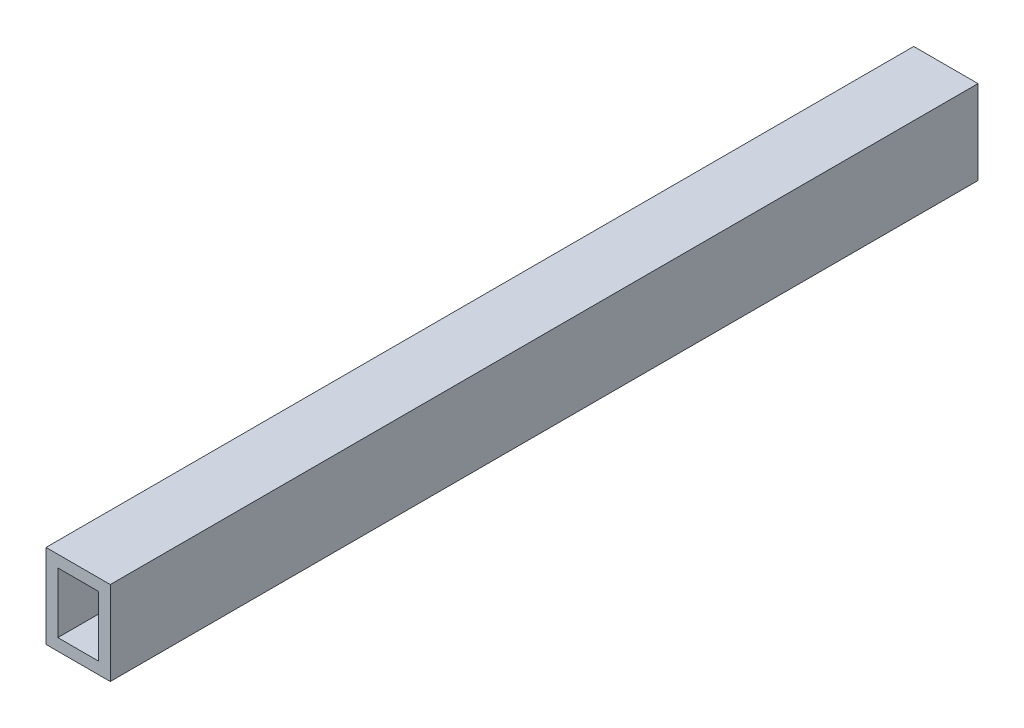
ISO-10303-21;
HEADER;
FILE_DESCRIPTION(('STEP AP214'),'2;1');
FILE_NAME('part.step','',(''),(''),'','','');
FILE_SCHEMA(('AUTOMOTIVE_DESIGN { 1 0 10303 214 1 1 1 1 }'));
ENDSEC;
DATA;
#1=APPLICATION_CONTEXT('core data for automotive mechanical design processes');
#2=APPLICATION_PROTOCOL_DEFINITION('international standard','automotive_design',2000,#1);
#3=PRODUCT_CONTEXT('',#1,'mechanical');
#4=PRODUCT('Part','Part','',(#3));
#5=PRODUCT_RELATED_PRODUCT_CATEGORY('part','',(#4));
#6=PRODUCT_DEFINITION_FORMATION('','',#4);
#7=PRODUCT_DEFINITION_CONTEXT('part definition',#1,'design');
#8=PRODUCT_DEFINITION('design','',#6,#7);
#9=PRODUCT_DEFINITION_SHAPE('','',#8);
#10=(LENGTH_UNIT() NAMED_UNIT(*) SI_UNIT(.MILLI.,.METRE.));
#11=(NAMED_UNIT(*) PLANE_ANGLE_UNIT() SI_UNIT($,.RADIAN.));
#12=(NAMED_UNIT(*) SI_UNIT($,.STERADIAN.) SOLID_ANGLE_UNIT());
#13=UNCERTAINTY_MEASURE_WITH_UNIT(LENGTH_MEASURE(1.E-05),#10,'distance_accuracy_value','');
#14=(GEOMETRIC_REPRESENTATION_CONTEXT(3) GLOBAL_UNCERTAINTY_ASSIGNED_CONTEXT((#13)) GLOBAL_UNIT_ASSIGNED_CONTEXT((#10,
#11,#12)) REPRESENTATION_CONTEXT('',''));
#15=CARTESIAN_POINT('',(0.,0.,0.));
#16=DIRECTION('',(0.,0.,1.));
#17=DIRECTION('',(1.,0.,0.));
#18=AXIS2_PLACEMENT_3D('',#15,#16,#17);
#19=CARTESIAN_POINT('',(0.,0.,220.));
#20=DIRECTION('',(0.,0.,1.));
#21=DIRECTION('',(1.,0.,0.));
#22=AXIS2_PLACEMENT_3D('',#19,#20,#21);
#23=PLANE('',#22);
#24=DIRECTION('',(0.,-1.,0.));
#25=VECTOR('',#24,1.);
#26=CARTESIAN_POINT('',(-8.15,10.65,220.));
#27=LINE('',#26,#25);
#28=CARTESIAN_POINT('',(-8.15,10.65,220.));
#29=VERTEX_POINT('',#28);
#30=CARTESIAN_POINT('',(-8.15,-10.65,220.));
#31=VERTEX_POINT('',#30);
#32=EDGE_CURVE('E136',#29,#31,#27,.T.);
#33=ORIENTED_EDGE('',*,*,#32,.T.);
#34=DIRECTION('',(1.,0.,0.));
#35=VECTOR('',#34,1.);
#36=CARTESIAN_POINT('',(-8.15,-10.65,220.));
#37=LINE('',#36,#35);
#38=CARTESIAN_POINT('',(8.15,-10.65,220.));
#39=VERTEX_POINT('',#38);
#40=EDGE_CURVE('E139',#31,#39,#37,.T.);
#41=ORIENTED_EDGE('',*,*,#40,.T.);
#42=DIRECTION('',(0.,1.,0.));
#43=VECTOR('',#42,1.);
#44=CARTESIAN_POINT('',(8.15,10.65,220.));
#45=LINE('',#44,#43);
#46=CARTESIAN_POINT('',(8.15,10.65,220.));
#47=VERTEX_POINT('',#46);
#48=EDGE_CURVE('E142',#39,#47,#45,.T.);
#49=ORIENTED_EDGE('',*,*,#48,.T.);
#50=DIRECTION('',(-1.,0.,0.));
#51=VECTOR('',#50,1.);
#52=CARTESIAN_POINT('',(-8.15,10.65,220.));
#53=LINE('',#52,#51);
#54=EDGE_CURVE('E144',#47,#29,#53,.T.);
#55=ORIENTED_EDGE('',*,*,#54,.T.);
#56=EDGE_LOOP('',(#33,#41,#49,#55));
#57=FACE_BOUND('',#56,.T.);
#58=DIRECTION('',(1.,0.,0.));
#59=VECTOR('',#58,1.);
#60=CARTESIAN_POINT('',(-5.15,-7.65,220.));
#61=LINE('',#60,#59);
#62=CARTESIAN_POINT('',(-5.15,-7.65,220.));
#63=VERTEX_POINT('',#62);
#64=CARTESIAN_POINT('',(5.15,-7.65,220.));
#65=VERTEX_POINT('',#64);
#66=EDGE_CURVE('E108',#63,#65,#61,.T.);
#67=ORIENTED_EDGE('',*,*,#66,.F.);
#68=DIRECTION('',(0.,-1.,0.));
#69=VECTOR('',#68,1.);
#70=CARTESIAN_POINT('',(-5.15,7.65,220.));
#71=LINE('',#70,#69);
#72=CARTESIAN_POINT('',(-5.15,7.65,220.));
#73=VERTEX_POINT('',#72);
#74=EDGE_CURVE('E100',#73,#63,#71,.T.);
#75=ORIENTED_EDGE('',*,*,#74,.F.);
#76=DIRECTION('',(-1.,0.,0.));
#77=VECTOR('',#76,1.);
#78=CARTESIAN_POINT('',(-5.15,7.65,220.));
#79=LINE('',#78,#77);
#80=CARTESIAN_POINT('',(5.15,7.65,220.));
#81=VERTEX_POINT('',#80);
#82=EDGE_CURVE('E122',#81,#73,#79,.T.);
#83=ORIENTED_EDGE('',*,*,#82,.F.);
#84=DIRECTION('',(0.,1.,0.));
#85=VECTOR('',#84,1.);
#86=CARTESIAN_POINT('',(5.15,7.65,220.));
#87=LINE('',#86,#85);
#88=EDGE_CURVE('E120',#65,#81,#87,.T.);
#89=ORIENTED_EDGE('',*,*,#88,.F.);
#90=EDGE_LOOP('',(#67,#75,#83,#89));
#91=FACE_BOUND('',#90,.T.);
#92=ADVANCED_FACE('F35',(#57,#91),#23,.T.);
#93=CARTESIAN_POINT('',(0.,0.,0.));
#94=DIRECTION('',(0.,0.,1.));
#95=DIRECTION('',(1.,0.,0.));
#96=AXIS2_PLACEMENT_3D('',#93,#94,#95);
#97=PLANE('',#96);
#98=DIRECTION('',(0.,-1.,0.));
#99=VECTOR('',#98,1.);
#100=CARTESIAN_POINT('',(-8.15,10.65,0.));
#101=LINE('',#100,#99);
#102=CARTESIAN_POINT('',(-8.15,10.65,0.));
#103=VERTEX_POINT('',#102);
#104=CARTESIAN_POINT('',(-8.15,-10.65,0.));
#105=VERTEX_POINT('',#104);
#106=EDGE_CURVE('E116',#103,#105,#101,.T.);
#107=ORIENTED_EDGE('',*,*,#106,.F.);
#108=DIRECTION('',(-1.,0.,0.));
#109=VECTOR('',#108,1.);
#110=CARTESIAN_POINT('',(-8.15,10.65,0.));
#111=LINE('',#110,#109);
#112=CARTESIAN_POINT('',(8.15,10.65,0.));
#113=VERTEX_POINT('',#112);
#114=EDGE_CURVE('E140',#113,#103,#111,.T.);
#115=ORIENTED_EDGE('',*,*,#114,.F.);
#116=DIRECTION('',(0.,1.,0.));
#117=VECTOR('',#116,1.);
#118=CARTESIAN_POINT('',(8.15,10.65,0.));
#119=LINE('',#118,#117);
#120=CARTESIAN_POINT('',(8.15,-10.65,0.));
#121=VERTEX_POINT('',#120);
#122=EDGE_CURVE('E151',#121,#113,#119,.T.);
#123=ORIENTED_EDGE('',*,*,#122,.F.);
#124=DIRECTION('',(1.,0.,0.));
#125=VECTOR('',#124,1.);
#126=CARTESIAN_POINT('',(-8.15,-10.65,0.));
#127=LINE('',#126,#125);
#128=EDGE_CURVE('E149',#105,#121,#127,.T.);
#129=ORIENTED_EDGE('',*,*,#128,.F.);
#130=EDGE_LOOP('',(#107,#115,#123,#129));
#131=FACE_BOUND('',#130,.T.);
#132=DIRECTION('',(0.,-1.,0.));
#133=VECTOR('',#132,1.);
#134=CARTESIAN_POINT('',(-5.15,7.65,0.));
#135=LINE('',#134,#133);
#136=CARTESIAN_POINT('',(-5.15,7.65,0.));
#137=VERTEX_POINT('',#136);
#138=CARTESIAN_POINT('',(-5.15,-7.65,0.));
#139=VERTEX_POINT('',#138);
#140=EDGE_CURVE('E58',#137,#139,#135,.T.);
#141=ORIENTED_EDGE('',*,*,#140,.T.);
#142=DIRECTION('',(1.,0.,0.));
#143=VECTOR('',#142,1.);
#144=CARTESIAN_POINT('',(-5.15,-7.65,0.));
#145=LINE('',#144,#143);
#146=CARTESIAN_POINT('',(5.15,-7.65,0.));
#147=VERTEX_POINT('',#146);
#148=EDGE_CURVE('E115',#139,#147,#145,.T.);
#149=ORIENTED_EDGE('',*,*,#148,.T.);
#150=DIRECTION('',(0.,1.,0.));
#151=VECTOR('',#150,1.);
#152=CARTESIAN_POINT('',(5.15,7.65,0.));
#153=LINE('',#152,#151);
#154=CARTESIAN_POINT('',(5.15,7.65,0.));
#155=VERTEX_POINT('',#154);
#156=EDGE_CURVE('E128',#147,#155,#153,.T.);
#157=ORIENTED_EDGE('',*,*,#156,.T.);
#158=DIRECTION('',(-1.,0.,0.));
#159=VECTOR('',#158,1.);
#160=CARTESIAN_POINT('',(-5.15,7.65,0.));
#161=LINE('',#160,#159);
#162=EDGE_CURVE('E109',#155,#137,#161,.T.);
#163=ORIENTED_EDGE('',*,*,#162,.T.);
#164=EDGE_LOOP('',(#141,#149,#157,#163));
#165=FACE_BOUND('',#164,.T.);
#166=ADVANCED_FACE('F169',(#131,#165),#97,.F.);
#167=CARTESIAN_POINT('',(-8.15,10.65,220.));
#168=DIRECTION('',(1.,0.,0.));
#169=DIRECTION('',(0.,1.,0.));
#170=AXIS2_PLACEMENT_3D('',#167,#168,#169);
#171=PLANE('',#170);
#172=ORIENTED_EDGE('',*,*,#106,.T.);
#173=DIRECTION('',(0.,0.,-1.));
#174=VECTOR('',#173,1.);
#175=CARTESIAN_POINT('',(-8.15,-10.65,220.));
#176=LINE('',#175,#174);
#177=EDGE_CURVE('E11',#31,#105,#176,.T.);
#178=ORIENTED_EDGE('',*,*,#177,.F.);
#179=ORIENTED_EDGE('',*,*,#32,.F.);
#180=DIRECTION('',(0.,0.,-1.));
#181=VECTOR('',#180,1.);
#182=CARTESIAN_POINT('',(-8.15,10.65,220.));
#183=LINE('',#182,#181);
#184=EDGE_CURVE('E146',#29,#103,#183,.T.);
#185=ORIENTED_EDGE('',*,*,#184,.T.);
#186=EDGE_LOOP('',(#172,#178,#179,#185));
#187=FACE_BOUND('',#186,.T.);
#188=ADVANCED_FACE('F37',(#187),#171,.F.);
#189=CARTESIAN_POINT('',(-8.15,-10.65,220.));
#190=DIRECTION('',(0.,1.,0.));
#191=DIRECTION('',(0.,0.,1.));
#192=AXIS2_PLACEMENT_3D('',#189,#190,#191);
#193=PLANE('',#192);
#194=ORIENTED_EDGE('',*,*,#128,.T.);
#195=DIRECTION('',(0.,0.,-1.));
#196=VECTOR('',#195,1.);
#197=CARTESIAN_POINT('',(8.15,-10.65,220.));
#198=LINE('',#197,#196);
#199=EDGE_CURVE('E43',#39,#121,#198,.T.);
#200=ORIENTED_EDGE('',*,*,#199,.F.);
#201=ORIENTED_EDGE('',*,*,#40,.F.);
#202=ORIENTED_EDGE('',*,*,#177,.T.);
#203=EDGE_LOOP('',(#194,#200,#201,#202));
#204=FACE_BOUND('',#203,.T.);
#205=ADVANCED_FACE('F179',(#204),#193,.F.);
#206=CARTESIAN_POINT('',(8.15,10.65,220.));
#207=DIRECTION('',(-1.,0.,0.));
#208=DIRECTION('',(0.,-1.,0.));
#209=AXIS2_PLACEMENT_3D('',#206,#207,#208);
#210=PLANE('',#209);
#211=ORIENTED_EDGE('',*,*,#122,.T.);
#212=DIRECTION('',(0.,0.,-1.));
#213=VECTOR('',#212,1.);
#214=CARTESIAN_POINT('',(8.15,10.65,220.));
#215=LINE('',#214,#213);
#216=EDGE_CURVE('E156',#47,#113,#215,.T.);
#217=ORIENTED_EDGE('',*,*,#216,.F.);
#218=ORIENTED_EDGE('',*,*,#48,.F.);
#219=ORIENTED_EDGE('',*,*,#199,.T.);
#220=EDGE_LOOP('',(#211,#217,#218,#219));
#221=FACE_BOUND('',#220,.T.);
#222=ADVANCED_FACE('F163',(#221),#210,.F.);
#223=CARTESIAN_POINT('',(-8.15,10.65,220.));
#224=DIRECTION('',(0.,-1.,0.));
#225=DIRECTION('',(0.,0.,-1.));
#226=AXIS2_PLACEMENT_3D('',#223,#224,#225);
#227=PLANE('',#226);
#228=ORIENTED_EDGE('',*,*,#114,.T.);
#229=ORIENTED_EDGE('',*,*,#184,.F.);
#230=ORIENTED_EDGE('',*,*,#54,.F.);
#231=ORIENTED_EDGE('',*,*,#216,.T.);
#232=EDGE_LOOP('',(#228,#229,#230,#231));
#233=FACE_BOUND('',#232,.T.);
#234=ADVANCED_FACE('F173',(#233),#227,.F.);
#235=CARTESIAN_POINT('',(-5.15,7.65,220.));
#236=DIRECTION('',(1.,0.,0.));
#237=DIRECTION('',(0.,0.,-1.));
#238=AXIS2_PLACEMENT_3D('',#235,#236,#237);
#239=PLANE('',#238);
#240=ORIENTED_EDGE('',*,*,#140,.F.);
#241=DIRECTION('',(0.,0.,-1.));
#242=VECTOR('',#241,1.);
#243=CARTESIAN_POINT('',(-5.15,7.65,220.));
#244=LINE('',#243,#242);
#245=EDGE_CURVE('E104',#73,#137,#244,.T.);
#246=ORIENTED_EDGE('',*,*,#245,.F.);
#247=ORIENTED_EDGE('',*,*,#74,.T.);
#248=DIRECTION('',(0.,0.,-1.));
#249=VECTOR('',#248,1.);
#250=CARTESIAN_POINT('',(-5.15,-7.65,220.));
#251=LINE('',#250,#249);
#252=EDGE_CURVE('E103',#63,#139,#251,.T.);
#253=ORIENTED_EDGE('',*,*,#252,.T.);
#254=EDGE_LOOP('',(#240,#246,#247,#253));
#255=FACE_BOUND('',#254,.T.);
#256=ADVANCED_FACE('F102',(#255),#239,.T.);
#257=CARTESIAN_POINT('',(-5.15,-7.65,220.));
#258=DIRECTION('',(0.,1.,0.));
#259=DIRECTION('',(-1.,0.,0.));
#260=AXIS2_PLACEMENT_3D('',#257,#258,#259);
#261=PLANE('',#260);
#262=ORIENTED_EDGE('',*,*,#148,.F.);
#263=ORIENTED_EDGE('',*,*,#252,.F.);
#264=ORIENTED_EDGE('',*,*,#66,.T.);
#265=DIRECTION('',(0.,0.,-1.));
#266=VECTOR('',#265,1.);
#267=CARTESIAN_POINT('',(5.15,-7.65,220.));
#268=LINE('',#267,#266);
#269=EDGE_CURVE('E117',#65,#147,#268,.T.);
#270=ORIENTED_EDGE('',*,*,#269,.T.);
#271=EDGE_LOOP('',(#262,#263,#264,#270));
#272=FACE_BOUND('',#271,.T.);
#273=ADVANCED_FACE('F112',(#272),#261,.T.);
#274=CARTESIAN_POINT('',(5.15,7.65,220.));
#275=DIRECTION('',(-1.,0.,0.));
#276=DIRECTION('',(0.,-1.,0.));
#277=AXIS2_PLACEMENT_3D('',#274,#275,#276);
#278=PLANE('',#277);
#279=ORIENTED_EDGE('',*,*,#156,.F.);
#280=ORIENTED_EDGE('',*,*,#269,.F.);
#281=ORIENTED_EDGE('',*,*,#88,.T.);
#282=DIRECTION('',(0.,0.,-1.));
#283=VECTOR('',#282,1.);
#284=CARTESIAN_POINT('',(5.15,7.65,220.));
#285=LINE('',#284,#283);
#286=EDGE_CURVE('E50',#81,#155,#285,.T.);
#287=ORIENTED_EDGE('',*,*,#286,.T.);
#288=EDGE_LOOP('',(#279,#280,#281,#287));
#289=FACE_BOUND('',#288,.T.);
#290=ADVANCED_FACE('F202',(#289),#278,.T.);
#291=CARTESIAN_POINT('',(-5.15,7.65,220.));
#292=DIRECTION('',(0.,-1.,0.));
#293=DIRECTION('',(0.,0.,-1.));
#294=AXIS2_PLACEMENT_3D('',#291,#292,#293);
#295=PLANE('',#294);
#296=ORIENTED_EDGE('',*,*,#162,.F.);
#297=ORIENTED_EDGE('',*,*,#286,.F.);
#298=ORIENTED_EDGE('',*,*,#82,.T.);
#299=ORIENTED_EDGE('',*,*,#245,.T.);
#300=EDGE_LOOP('',(#296,#297,#298,#299));
#301=FACE_BOUND('',#300,.T.);
#302=ADVANCED_FACE('F206',(#301),#295,.T.);
#303=CLOSED_SHELL('',(#92,#166,#188,#205,#222,#234,#256,#273,#290,#302));
#304=MANIFOLD_SOLID_BREP('B2',#303);
#305=ADVANCED_BREP_SHAPE_REPRESENTATION('',(#18,#304),#14);
#306=SHAPE_DEFINITION_REPRESENTATION(#9,#305);
ENDSEC;
END-ISO-10303-21;
